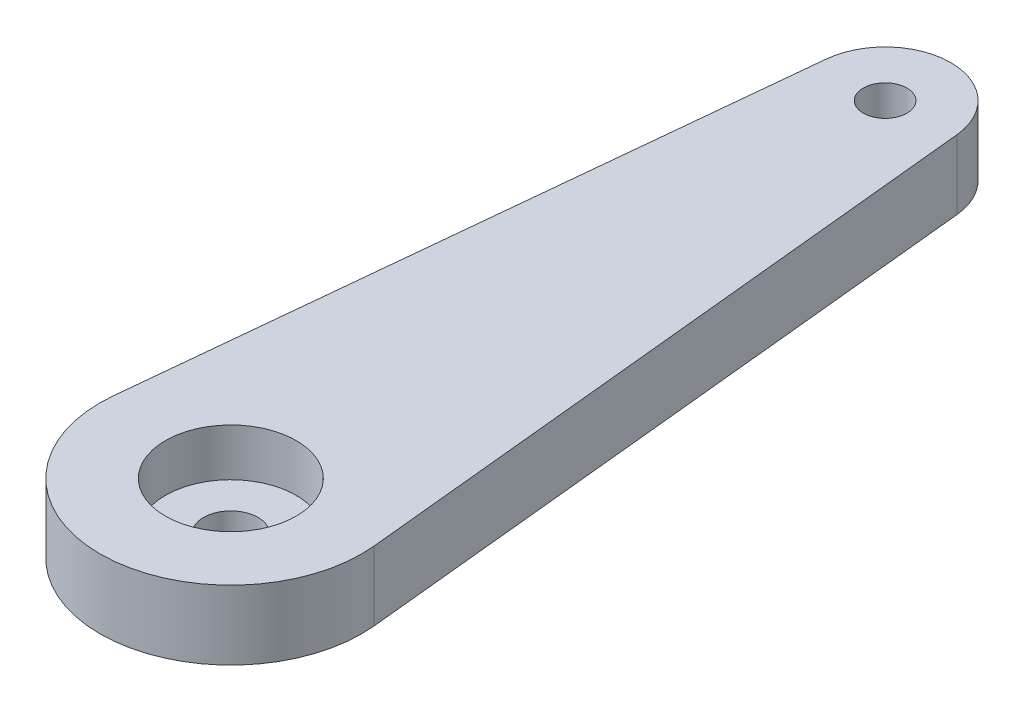
ISO-10303-21;
HEADER;
FILE_DESCRIPTION(('STEP AP214'),'2;1');
FILE_NAME('part.step','',(''),(''),'','','');
FILE_SCHEMA(('AUTOMOTIVE_DESIGN { 1 0 10303 214 1 1 1 1 }'));
ENDSEC;
DATA;
#1=APPLICATION_CONTEXT('core data for automotive mechanical design processes');
#2=APPLICATION_PROTOCOL_DEFINITION('international standard','automotive_design',2000,#1);
#3=PRODUCT_CONTEXT('',#1,'mechanical');
#4=PRODUCT('Part','Part','',(#3));
#5=PRODUCT_RELATED_PRODUCT_CATEGORY('part','',(#4));
#6=PRODUCT_DEFINITION_FORMATION('','',#4);
#7=PRODUCT_DEFINITION_CONTEXT('part definition',#1,'design');
#8=PRODUCT_DEFINITION('design','',#6,#7);
#9=PRODUCT_DEFINITION_SHAPE('','',#8);
#10=(LENGTH_UNIT() NAMED_UNIT(*) SI_UNIT(.MILLI.,.METRE.));
#11=(NAMED_UNIT(*) PLANE_ANGLE_UNIT() SI_UNIT($,.RADIAN.));
#12=(NAMED_UNIT(*) SI_UNIT($,.STERADIAN.) SOLID_ANGLE_UNIT());
#13=UNCERTAINTY_MEASURE_WITH_UNIT(LENGTH_MEASURE(1.E-05),#10,'distance_accuracy_value','');
#14=(GEOMETRIC_REPRESENTATION_CONTEXT(3) GLOBAL_UNCERTAINTY_ASSIGNED_CONTEXT((#13)) GLOBAL_UNIT_ASSIGNED_CONTEXT((#10,
#11,#12)) REPRESENTATION_CONTEXT('',''));
#15=CARTESIAN_POINT('',(0.,0.,0.));
#16=DIRECTION('',(0.,0.,1.));
#17=DIRECTION('',(1.,0.,0.));
#18=AXIS2_PLACEMENT_3D('',#15,#16,#17);
#19=CARTESIAN_POINT('',(0.,3.175,0.));
#20=DIRECTION('',(0.,-1.,0.));
#21=DIRECTION('',(0.,0.,-1.));
#22=AXIS2_PLACEMENT_3D('',#19,#20,#21);
#23=CYLINDRICAL_SURFACE('',#22,3.);
#24=CARTESIAN_POINT('',(0.,1.,0.));
#25=DIRECTION('',(0.,1.,0.));
#26=DIRECTION('',(0.,0.,1.));
#27=AXIS2_PLACEMENT_3D('',#24,#25,#26);
#28=CIRCLE('',#27,3.);
#29=CARTESIAN_POINT('',(0.,1.,3.));
#30=VERTEX_POINT('',#29);
#31=EDGE_CURVE('E13',#30,#30,#28,.T.);
#32=ORIENTED_EDGE('',*,*,#31,.F.);
#33=EDGE_LOOP('',(#32));
#34=FACE_BOUND('',#33,.T.);
#35=CARTESIAN_POINT('',(0.,3.175,0.));
#36=DIRECTION('',(0.,1.,0.));
#37=DIRECTION('',(0.,0.,1.));
#38=AXIS2_PLACEMENT_3D('',#35,#36,#37);
#39=CIRCLE('',#38,3.);
#40=CARTESIAN_POINT('',(0.,3.175,3.));
#41=VERTEX_POINT('',#40);
#42=EDGE_CURVE('E240',#41,#41,#39,.T.);
#43=ORIENTED_EDGE('',*,*,#42,.T.);
#44=EDGE_LOOP('',(#43));
#45=FACE_BOUND('',#44,.T.);
#46=ADVANCED_FACE('F134',(#34,#45),#23,.F.);
#47=CARTESIAN_POINT('',(0.,0.,0.));
#48=DIRECTION('',(0.,1.,0.));
#49=DIRECTION('',(0.,0.,1.));
#50=AXIS2_PLACEMENT_3D('',#47,#48,#49);
#51=PLANE('',#50);
#52=CARTESIAN_POINT('',(0.,0.,-30.));
#53=DIRECTION('',(0.,1.,0.));
#54=DIRECTION('',(0.,0.,1.));
#55=AXIS2_PLACEMENT_3D('',#52,#53,#54);
#56=CIRCLE('',#55,1.);
#57=CARTESIAN_POINT('',(0.,0.,-29.));
#58=VERTEX_POINT('',#57);
#59=EDGE_CURVE('E206',#58,#58,#56,.T.);
#60=ORIENTED_EDGE('',*,*,#59,.T.);
#61=EDGE_LOOP('',(#60));
#62=FACE_BOUND('',#61,.T.);
#63=DIRECTION('',(-0.0995012685383519,0.,0.995037435255206));
#64=VECTOR('',#63,1.);
#65=CARTESIAN_POINT('',(-5.97022461153124,0.,-0.597007611230111));
#66=LINE('',#65,#64);
#67=CARTESIAN_POINT('',(-3.,0.,-30.2999925380079));
#68=VERTEX_POINT('',#67);
#69=CARTESIAN_POINT('',(-5.97022461153124,0.,-0.597007611230111));
#70=VERTEX_POINT('',#69);
#71=EDGE_CURVE('E211',#68,#70,#66,.T.);
#72=ORIENTED_EDGE('',*,*,#71,.F.);
#73=CARTESIAN_POINT('',(0.,0.,-30.));
#74=DIRECTION('',(0.,1.,0.));
#75=DIRECTION('',(0.,0.,1.));
#76=AXIS2_PLACEMENT_3D('',#73,#74,#75);
#77=CIRCLE('',#76,3.01496194384944);
#78=CARTESIAN_POINT('',(3.,0.,-30.2999925380079));
#79=VERTEX_POINT('',#78);
#80=EDGE_CURVE('E223',#68,#79,#77,.F.);
#81=ORIENTED_EDGE('',*,*,#80,.T.);
#82=DIRECTION('',(0.099501268538352,0.,0.995037435255206));
#83=VECTOR('',#82,1.);
#84=CARTESIAN_POINT('',(5.97022461153124,0.,-0.597007611230112));
#85=LINE('',#84,#83);
#86=CARTESIAN_POINT('',(5.97022461153124,0.,-0.597007611230112));
#87=VERTEX_POINT('',#86);
#88=EDGE_CURVE('E219',#79,#87,#85,.T.);
#89=ORIENTED_EDGE('',*,*,#88,.T.);
#90=CARTESIAN_POINT('',(0.,0.,0.));
#91=DIRECTION('',(0.,1.,0.));
#92=DIRECTION('',(0.,0.,1.));
#93=AXIS2_PLACEMENT_3D('',#90,#91,#92);
#94=CIRCLE('',#93,6.);
#95=EDGE_CURVE('E193',#70,#87,#94,.T.);
#96=ORIENTED_EDGE('',*,*,#95,.F.);
#97=EDGE_LOOP('',(#72,#81,#89,#96));
#98=FACE_BOUND('',#97,.T.);
#99=CARTESIAN_POINT('',(0.,0.,0.));
#100=DIRECTION('',(0.,1.,0.));
#101=DIRECTION('',(0.,0.,1.));
#102=AXIS2_PLACEMENT_3D('',#99,#100,#101);
#103=CIRCLE('',#102,1.25);
#104=CARTESIAN_POINT('',(0.,0.,1.25));
#105=VERTEX_POINT('',#104);
#106=EDGE_CURVE('E245',#105,#105,#103,.T.);
#107=ORIENTED_EDGE('',*,*,#106,.T.);
#108=EDGE_LOOP('',(#107));
#109=FACE_BOUND('',#108,.T.);
#110=ADVANCED_FACE('F265',(#62,#98,#109),#51,.F.);
#111=CARTESIAN_POINT('',(0.,3.175,-30.));
#112=DIRECTION('',(0.,-1.,0.));
#113=DIRECTION('',(0.,0.,-1.));
#114=AXIS2_PLACEMENT_3D('',#111,#112,#113);
#115=CYLINDRICAL_SURFACE('',#114,1.);
#116=CARTESIAN_POINT('',(0.,3.175,-30.));
#117=DIRECTION('',(0.,1.,0.));
#118=DIRECTION('',(0.,0.,1.));
#119=AXIS2_PLACEMENT_3D('',#116,#117,#118);
#120=CIRCLE('',#119,1.);
#121=CARTESIAN_POINT('',(0.,3.175,-29.));
#122=VERTEX_POINT('',#121);
#123=EDGE_CURVE('E228',#122,#122,#120,.T.);
#124=ORIENTED_EDGE('',*,*,#123,.T.);
#125=EDGE_LOOP('',(#124));
#126=FACE_BOUND('',#125,.T.);
#127=ORIENTED_EDGE('',*,*,#59,.F.);
#128=EDGE_LOOP('',(#127));
#129=FACE_BOUND('',#128,.T.);
#130=ADVANCED_FACE('F136',(#126,#129),#115,.F.);
#131=CARTESIAN_POINT('',(5.97022461153124,3.175,-0.597007611230112));
#132=DIRECTION('',(0.995037435255206,0.,-0.099501268538352));
#133=DIRECTION('',(-0.099501268538352,0.,-0.995037435255206));
#134=AXIS2_PLACEMENT_3D('',#131,#132,#133);
#135=PLANE('',#134);
#136=ORIENTED_EDGE('',*,*,#88,.F.);
#137=DIRECTION('',(0.,-1.,0.));
#138=VECTOR('',#137,1.);
#139=CARTESIAN_POINT('',(3.,3.175,-30.2999925380079));
#140=LINE('',#139,#138);
#141=CARTESIAN_POINT('',(3.,3.175,-30.2999925380079));
#142=VERTEX_POINT('',#141);
#143=EDGE_CURVE('E166',#142,#79,#140,.T.);
#144=ORIENTED_EDGE('',*,*,#143,.F.);
#145=DIRECTION('',(0.099501268538352,0.,0.995037435255206));
#146=VECTOR('',#145,1.);
#147=CARTESIAN_POINT('',(5.97022461153124,3.175,-0.597007611230112));
#148=LINE('',#147,#146);
#149=CARTESIAN_POINT('',(5.97022461153124,3.175,-0.597007611230112));
#150=VERTEX_POINT('',#149);
#151=EDGE_CURVE('E185',#142,#150,#148,.T.);
#152=ORIENTED_EDGE('',*,*,#151,.T.);
#153=DIRECTION('',(0.,-1.,0.));
#154=VECTOR('',#153,1.);
#155=CARTESIAN_POINT('',(5.97022461153124,3.175,-0.597007611230112));
#156=LINE('',#155,#154);
#157=EDGE_CURVE('E191',#150,#87,#156,.T.);
#158=ORIENTED_EDGE('',*,*,#157,.T.);
#159=EDGE_LOOP('',(#136,#144,#152,#158));
#160=FACE_BOUND('',#159,.T.);
#161=ADVANCED_FACE('F198',(#160),#135,.T.);
#162=CARTESIAN_POINT('',(0.,3.175,0.));
#163=DIRECTION('',(0.,-1.,0.));
#164=DIRECTION('',(0.,0.,-1.));
#165=AXIS2_PLACEMENT_3D('',#162,#163,#164);
#166=CYLINDRICAL_SURFACE('',#165,6.);
#167=ORIENTED_EDGE('',*,*,#95,.T.);
#168=ORIENTED_EDGE('',*,*,#157,.F.);
#169=CARTESIAN_POINT('',(0.,3.175,0.));
#170=DIRECTION('',(0.,1.,0.));
#171=DIRECTION('',(0.,0.,1.));
#172=AXIS2_PLACEMENT_3D('',#169,#170,#171);
#173=CIRCLE('',#172,6.);
#174=CARTESIAN_POINT('',(-5.97022461153124,3.175,-0.597007611230111));
#175=VERTEX_POINT('',#174);
#176=EDGE_CURVE('E178',#175,#150,#173,.T.);
#177=ORIENTED_EDGE('',*,*,#176,.F.);
#178=DIRECTION('',(0.,-1.,0.));
#179=VECTOR('',#178,1.);
#180=CARTESIAN_POINT('',(-5.97022461153124,3.175,-0.597007611230111));
#181=LINE('',#180,#179);
#182=EDGE_CURVE('E144',#175,#70,#181,.T.);
#183=ORIENTED_EDGE('',*,*,#182,.T.);
#184=EDGE_LOOP('',(#167,#168,#177,#183));
#185=FACE_BOUND('',#184,.T.);
#186=ADVANCED_FACE('F192',(#185),#166,.T.);
#187=CARTESIAN_POINT('',(-5.97022461153124,3.175,-0.597007611230111));
#188=DIRECTION('',(0.995037435255206,0.,0.0995012685383519));
#189=DIRECTION('',(0.0995012685383519,0.,-0.995037435255206));
#190=AXIS2_PLACEMENT_3D('',#187,#188,#189);
#191=PLANE('',#190);
#192=ORIENTED_EDGE('',*,*,#71,.T.);
#193=ORIENTED_EDGE('',*,*,#182,.F.);
#194=DIRECTION('',(-0.0995012685383519,0.,0.995037435255206));
#195=VECTOR('',#194,1.);
#196=CARTESIAN_POINT('',(-5.97022461153124,3.175,-0.597007611230111));
#197=LINE('',#196,#195);
#198=CARTESIAN_POINT('',(-3.,3.175,-30.2999925380079));
#199=VERTEX_POINT('',#198);
#200=EDGE_CURVE('E186',#199,#175,#197,.T.);
#201=ORIENTED_EDGE('',*,*,#200,.F.);
#202=DIRECTION('',(0.,-1.,0.));
#203=VECTOR('',#202,1.);
#204=CARTESIAN_POINT('',(-3.,3.175,-30.2999925380079));
#205=LINE('',#204,#203);
#206=EDGE_CURVE('E152',#199,#68,#205,.T.);
#207=ORIENTED_EDGE('',*,*,#206,.T.);
#208=EDGE_LOOP('',(#192,#193,#201,#207));
#209=FACE_BOUND('',#208,.T.);
#210=ADVANCED_FACE('F233',(#209),#191,.F.);
#211=CARTESIAN_POINT('',(0.,3.175,-30.));
#212=DIRECTION('',(0.,-1.,0.));
#213=DIRECTION('',(0.,0.,-1.));
#214=AXIS2_PLACEMENT_3D('',#211,#212,#213);
#215=CYLINDRICAL_SURFACE('',#214,3.01496194384944);
#216=ORIENTED_EDGE('',*,*,#80,.F.);
#217=ORIENTED_EDGE('',*,*,#206,.F.);
#218=CARTESIAN_POINT('',(0.,3.175,-30.));
#219=DIRECTION('',(0.,1.,0.));
#220=DIRECTION('',(0.,0.,1.));
#221=AXIS2_PLACEMENT_3D('',#218,#219,#220);
#222=CIRCLE('',#221,3.01496194384944);
#223=EDGE_CURVE('E200',#199,#142,#222,.F.);
#224=ORIENTED_EDGE('',*,*,#223,.T.);
#225=ORIENTED_EDGE('',*,*,#143,.T.);
#226=EDGE_LOOP('',(#216,#217,#224,#225));
#227=FACE_BOUND('',#226,.T.);
#228=ADVANCED_FACE('F277',(#227),#215,.T.);
#229=CARTESIAN_POINT('',(0.,3.175,0.));
#230=DIRECTION('',(0.,1.,0.));
#231=DIRECTION('',(0.,0.,1.));
#232=AXIS2_PLACEMENT_3D('',#229,#230,#231);
#233=PLANE('',#232);
#234=ORIENTED_EDGE('',*,*,#123,.F.);
#235=EDGE_LOOP('',(#234));
#236=FACE_BOUND('',#235,.T.);
#237=ORIENTED_EDGE('',*,*,#42,.F.);
#238=EDGE_LOOP('',(#237));
#239=FACE_BOUND('',#238,.T.);
#240=ORIENTED_EDGE('',*,*,#200,.T.);
#241=ORIENTED_EDGE('',*,*,#176,.T.);
#242=ORIENTED_EDGE('',*,*,#151,.F.);
#243=ORIENTED_EDGE('',*,*,#223,.F.);
#244=EDGE_LOOP('',(#240,#241,#242,#243));
#245=FACE_BOUND('',#244,.T.);
#246=ADVANCED_FACE('F182',(#236,#239,#245),#233,.T.);
#247=CARTESIAN_POINT('',(0.,1.,0.));
#248=DIRECTION('',(0.,-1.,0.));
#249=DIRECTION('',(0.,0.,-1.));
#250=AXIS2_PLACEMENT_3D('',#247,#248,#249);
#251=CYLINDRICAL_SURFACE('',#250,1.25);
#252=CARTESIAN_POINT('',(0.,1.,0.));
#253=DIRECTION('',(0.,1.,0.));
#254=DIRECTION('',(0.,0.,1.));
#255=AXIS2_PLACEMENT_3D('',#252,#253,#254);
#256=CIRCLE('',#255,1.25);
#257=CARTESIAN_POINT('',(0.,1.,1.25));
#258=VERTEX_POINT('',#257);
#259=EDGE_CURVE('E212',#258,#258,#256,.T.);
#260=ORIENTED_EDGE('',*,*,#259,.T.);
#261=EDGE_LOOP('',(#260));
#262=FACE_BOUND('',#261,.T.);
#263=ORIENTED_EDGE('',*,*,#106,.F.);
#264=EDGE_LOOP('',(#263));
#265=FACE_BOUND('',#264,.T.);
#266=ADVANCED_FACE('F254',(#262,#265),#251,.F.);
#267=CARTESIAN_POINT('',(0.,1.,0.));
#268=DIRECTION('',(0.,1.,0.));
#269=DIRECTION('',(0.,0.,1.));
#270=AXIS2_PLACEMENT_3D('',#267,#268,#269);
#271=PLANE('',#270);
#272=ORIENTED_EDGE('',*,*,#31,.T.);
#273=EDGE_LOOP('',(#272));
#274=FACE_BOUND('',#273,.T.);
#275=ORIENTED_EDGE('',*,*,#259,.F.);
#276=EDGE_LOOP('',(#275));
#277=FACE_BOUND('',#276,.T.);
#278=ADVANCED_FACE('F257',(#274,#277),#271,.T.);
#279=CLOSED_SHELL('',(#46,#110,#130,#161,#186,#210,#228,#246,#266,#278));
#280=MANIFOLD_SOLID_BREP('B2',#279);
#281=ADVANCED_BREP_SHAPE_REPRESENTATION('',(#18,#280),#14);
#282=SHAPE_DEFINITION_REPRESENTATION(#9,#281);
ENDSEC;
END-ISO-10303-21;
